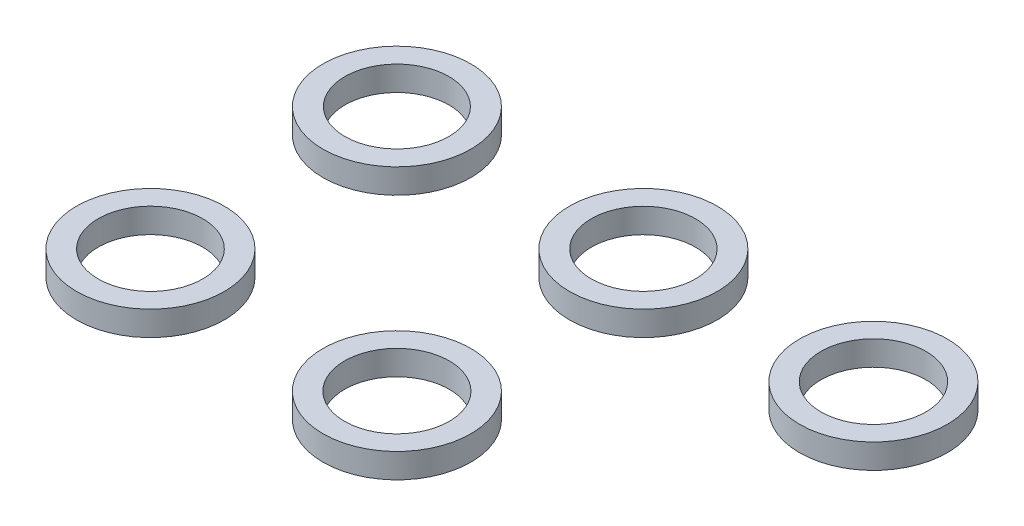
ISO-10303-21;
HEADER;
FILE_DESCRIPTION(('STEP AP214'),'2;1');
FILE_NAME('part.step','',(''),(''),'','','');
FILE_SCHEMA(('AUTOMOTIVE_DESIGN { 1 0 10303 214 1 1 1 1 }'));
ENDSEC;
DATA;
#1=APPLICATION_CONTEXT('core data for automotive mechanical design processes');
#2=APPLICATION_PROTOCOL_DEFINITION('international standard','automotive_design',2000,#1);
#3=PRODUCT_CONTEXT('',#1,'mechanical');
#4=PRODUCT('Part','Part','',(#3));
#5=PRODUCT_RELATED_PRODUCT_CATEGORY('part','',(#4));
#6=PRODUCT_DEFINITION_FORMATION('','',#4);
#7=PRODUCT_DEFINITION_CONTEXT('part definition',#1,'design');
#8=PRODUCT_DEFINITION('design','',#6,#7);
#9=PRODUCT_DEFINITION_SHAPE('','',#8);
#10=(LENGTH_UNIT() NAMED_UNIT(*) SI_UNIT(.MILLI.,.METRE.));
#11=(NAMED_UNIT(*) PLANE_ANGLE_UNIT() SI_UNIT($,.RADIAN.));
#12=(NAMED_UNIT(*) SI_UNIT($,.STERADIAN.) SOLID_ANGLE_UNIT());
#13=UNCERTAINTY_MEASURE_WITH_UNIT(LENGTH_MEASURE(1.E-05),#10,'distance_accuracy_value','');
#14=(GEOMETRIC_REPRESENTATION_CONTEXT(3) GLOBAL_UNCERTAINTY_ASSIGNED_CONTEXT((#13)) GLOBAL_UNIT_ASSIGNED_CONTEXT((#10,
#11,#12)) REPRESENTATION_CONTEXT('',''));
#15=CARTESIAN_POINT('',(0.,0.,0.));
#16=DIRECTION('',(0.,0.,1.));
#17=DIRECTION('',(1.,0.,0.));
#18=AXIS2_PLACEMENT_3D('',#15,#16,#17);
#19=CARTESIAN_POINT('',(96.6723692590399,5.,0.));
#20=DIRECTION('',(0.,1.,0.));
#21=DIRECTION('',(0.,0.,1.));
#22=AXIS2_PLACEMENT_3D('',#19,#20,#21);
#23=PLANE('',#22);
#24=CARTESIAN_POINT('',(96.6723692590399,5.,0.));
#25=DIRECTION('',(0.,1.,0.));
#26=DIRECTION('',(0.,0.,1.));
#27=AXIS2_PLACEMENT_3D('',#24,#25,#26);
#28=CIRCLE('',#27,15.);
#29=CARTESIAN_POINT('',(96.6723692590399,5.,15.));
#30=VERTEX_POINT('',#29);
#31=EDGE_CURVE('E65',#30,#30,#28,.T.);
#32=ORIENTED_EDGE('',*,*,#31,.T.);
#33=EDGE_LOOP('',(#32));
#34=FACE_BOUND('',#33,.T.);
#35=CARTESIAN_POINT('',(96.6723692590399,5.,0.));
#36=DIRECTION('',(0.,1.,0.));
#37=DIRECTION('',(0.,0.,1.));
#38=AXIS2_PLACEMENT_3D('',#35,#36,#37);
#39=CIRCLE('',#38,10.65);
#40=CARTESIAN_POINT('',(96.6723692590399,5.,10.65));
#41=VERTEX_POINT('',#40);
#42=EDGE_CURVE('E56',#41,#41,#39,.T.);
#43=ORIENTED_EDGE('',*,*,#42,.F.);
#44=EDGE_LOOP('',(#43));
#45=FACE_BOUND('',#44,.T.);
#46=ADVANCED_FACE('F52',(#34,#45),#23,.T.);
#47=CARTESIAN_POINT('',(96.6723692590399,0.,0.));
#48=DIRECTION('',(0.,1.,0.));
#49=DIRECTION('',(0.,0.,1.));
#50=AXIS2_PLACEMENT_3D('',#47,#48,#49);
#51=PLANE('',#50);
#52=CARTESIAN_POINT('',(96.6723692590399,0.,0.));
#53=DIRECTION('',(0.,1.,0.));
#54=DIRECTION('',(0.,0.,1.));
#55=AXIS2_PLACEMENT_3D('',#52,#53,#54);
#56=CIRCLE('',#55,15.);
#57=CARTESIAN_POINT('',(96.6723692590399,0.,15.));
#58=VERTEX_POINT('',#57);
#59=EDGE_CURVE('E63',#58,#58,#56,.T.);
#60=ORIENTED_EDGE('',*,*,#59,.F.);
#61=EDGE_LOOP('',(#60));
#62=FACE_BOUND('',#61,.T.);
#63=CARTESIAN_POINT('',(96.6723692590399,0.,0.));
#64=DIRECTION('',(0.,1.,0.));
#65=DIRECTION('',(0.,0.,1.));
#66=AXIS2_PLACEMENT_3D('',#63,#64,#65);
#67=CIRCLE('',#66,10.65);
#68=CARTESIAN_POINT('',(96.6723692590399,0.,10.65));
#69=VERTEX_POINT('',#68);
#70=EDGE_CURVE('E11',#69,#69,#67,.T.);
#71=ORIENTED_EDGE('',*,*,#70,.T.);
#72=EDGE_LOOP('',(#71));
#73=FACE_BOUND('',#72,.T.);
#74=ADVANCED_FACE('F73',(#62,#73),#51,.F.);
#75=CARTESIAN_POINT('',(96.6723692590399,5.,0.));
#76=DIRECTION('',(0.,-1.,0.));
#77=DIRECTION('',(0.,0.,-1.));
#78=AXIS2_PLACEMENT_3D('',#75,#76,#77);
#79=CYLINDRICAL_SURFACE('',#78,15.);
#80=ORIENTED_EDGE('',*,*,#31,.F.);
#81=EDGE_LOOP('',(#80));
#82=FACE_BOUND('',#81,.T.);
#83=ORIENTED_EDGE('',*,*,#59,.T.);
#84=EDGE_LOOP('',(#83));
#85=FACE_BOUND('',#84,.T.);
#86=ADVANCED_FACE('F71',(#82,#85),#79,.T.);
#87=CARTESIAN_POINT('',(96.6723692590399,5.,0.));
#88=DIRECTION('',(0.,-1.,0.));
#89=DIRECTION('',(0.,0.,-1.));
#90=AXIS2_PLACEMENT_3D('',#87,#88,#89);
#91=CYLINDRICAL_SURFACE('',#90,10.65);
#92=ORIENTED_EDGE('',*,*,#42,.T.);
#93=EDGE_LOOP('',(#92));
#94=FACE_BOUND('',#93,.T.);
#95=ORIENTED_EDGE('',*,*,#70,.F.);
#96=EDGE_LOOP('',(#95));
#97=FACE_BOUND('',#96,.T.);
#98=ADVANCED_FACE('F54',(#94,#97),#91,.F.);
#99=CLOSED_SHELL('',(#46,#74,#86,#98));
#100=MANIFOLD_SOLID_BREP('B2',#99);
#101=CARTESIAN_POINT('',(50.,5.,50.));
#102=DIRECTION('',(0.,1.,0.));
#103=DIRECTION('',(0.,0.,1.));
#104=AXIS2_PLACEMENT_3D('',#101,#102,#103);
#105=PLANE('',#104);
#106=CARTESIAN_POINT('',(50.,5.,50.));
#107=DIRECTION('',(0.,1.,0.));
#108=DIRECTION('',(0.,0.,1.));
#109=AXIS2_PLACEMENT_3D('',#106,#107,#108);
#110=CIRCLE('',#109,15.);
#111=CARTESIAN_POINT('',(50.,5.,65.));
#112=VERTEX_POINT('',#111);
#113=EDGE_CURVE('E135',#112,#112,#110,.T.);
#114=ORIENTED_EDGE('',*,*,#113,.T.);
#115=EDGE_LOOP('',(#114));
#116=FACE_BOUND('',#115,.T.);
#117=CARTESIAN_POINT('',(50.,5.,50.));
#118=DIRECTION('',(0.,1.,0.));
#119=DIRECTION('',(0.,0.,1.));
#120=AXIS2_PLACEMENT_3D('',#117,#118,#119);
#121=CIRCLE('',#120,10.625);
#122=CARTESIAN_POINT('',(50.,5.,60.625));
#123=VERTEX_POINT('',#122);
#124=EDGE_CURVE('E126',#123,#123,#121,.T.);
#125=ORIENTED_EDGE('',*,*,#124,.F.);
#126=EDGE_LOOP('',(#125));
#127=FACE_BOUND('',#126,.T.);
#128=ADVANCED_FACE('F122',(#116,#127),#105,.T.);
#129=CARTESIAN_POINT('',(50.,0.,50.));
#130=DIRECTION('',(0.,1.,0.));
#131=DIRECTION('',(0.,0.,1.));
#132=AXIS2_PLACEMENT_3D('',#129,#130,#131);
#133=PLANE('',#132);
#134=CARTESIAN_POINT('',(50.,0.,50.));
#135=DIRECTION('',(0.,1.,0.));
#136=DIRECTION('',(0.,0.,1.));
#137=AXIS2_PLACEMENT_3D('',#134,#135,#136);
#138=CIRCLE('',#137,15.);
#139=CARTESIAN_POINT('',(50.,0.,65.));
#140=VERTEX_POINT('',#139);
#141=EDGE_CURVE('E133',#140,#140,#138,.T.);
#142=ORIENTED_EDGE('',*,*,#141,.F.);
#143=EDGE_LOOP('',(#142));
#144=FACE_BOUND('',#143,.T.);
#145=CARTESIAN_POINT('',(50.,0.,50.));
#146=DIRECTION('',(0.,1.,0.));
#147=DIRECTION('',(0.,0.,1.));
#148=AXIS2_PLACEMENT_3D('',#145,#146,#147);
#149=CIRCLE('',#148,10.625);
#150=CARTESIAN_POINT('',(50.,0.,60.625));
#151=VERTEX_POINT('',#150);
#152=EDGE_CURVE('E51',#151,#151,#149,.T.);
#153=ORIENTED_EDGE('',*,*,#152,.T.);
#154=EDGE_LOOP('',(#153));
#155=FACE_BOUND('',#154,.T.);
#156=ADVANCED_FACE('F143',(#144,#155),#133,.F.);
#157=CARTESIAN_POINT('',(50.,5.,50.));
#158=DIRECTION('',(0.,-1.,0.));
#159=DIRECTION('',(0.,0.,-1.));
#160=AXIS2_PLACEMENT_3D('',#157,#158,#159);
#161=CYLINDRICAL_SURFACE('',#160,15.);
#162=ORIENTED_EDGE('',*,*,#113,.F.);
#163=EDGE_LOOP('',(#162));
#164=FACE_BOUND('',#163,.T.);
#165=ORIENTED_EDGE('',*,*,#141,.T.);
#166=EDGE_LOOP('',(#165));
#167=FACE_BOUND('',#166,.T.);
#168=ADVANCED_FACE('F141',(#164,#167),#161,.T.);
#169=CARTESIAN_POINT('',(50.,5.,50.));
#170=DIRECTION('',(0.,-1.,0.));
#171=DIRECTION('',(0.,0.,-1.));
#172=AXIS2_PLACEMENT_3D('',#169,#170,#171);
#173=CYLINDRICAL_SURFACE('',#172,10.625);
#174=ORIENTED_EDGE('',*,*,#124,.T.);
#175=EDGE_LOOP('',(#174));
#176=FACE_BOUND('',#175,.T.);
#177=ORIENTED_EDGE('',*,*,#152,.F.);
#178=EDGE_LOOP('',(#177));
#179=FACE_BOUND('',#178,.T.);
#180=ADVANCED_FACE('F124',(#176,#179),#173,.F.);
#181=CLOSED_SHELL('',(#128,#156,#168,#180));
#182=MANIFOLD_SOLID_BREP('B6',#181);
#183=CARTESIAN_POINT('',(0.,5.,50.));
#184=DIRECTION('',(0.,1.,0.));
#185=DIRECTION('',(0.,0.,1.));
#186=AXIS2_PLACEMENT_3D('',#183,#184,#185);
#187=PLANE('',#186);
#188=CARTESIAN_POINT('',(0.,5.,50.));
#189=DIRECTION('',(0.,1.,0.));
#190=DIRECTION('',(0.,0.,1.));
#191=AXIS2_PLACEMENT_3D('',#188,#189,#190);
#192=CIRCLE('',#191,15.);
#193=CARTESIAN_POINT('',(0.,5.,65.));
#194=VERTEX_POINT('',#193);
#195=EDGE_CURVE('E205',#194,#194,#192,.T.);
#196=ORIENTED_EDGE('',*,*,#195,.T.);
#197=EDGE_LOOP('',(#196));
#198=FACE_BOUND('',#197,.T.);
#199=CARTESIAN_POINT('',(0.,5.,50.));
#200=DIRECTION('',(0.,1.,0.));
#201=DIRECTION('',(0.,0.,1.));
#202=AXIS2_PLACEMENT_3D('',#199,#200,#201);
#203=CIRCLE('',#202,10.6);
#204=CARTESIAN_POINT('',(0.,5.,60.6));
#205=VERTEX_POINT('',#204);
#206=EDGE_CURVE('E196',#205,#205,#203,.T.);
#207=ORIENTED_EDGE('',*,*,#206,.F.);
#208=EDGE_LOOP('',(#207));
#209=FACE_BOUND('',#208,.T.);
#210=ADVANCED_FACE('F192',(#198,#209),#187,.T.);
#211=CARTESIAN_POINT('',(0.,0.,50.));
#212=DIRECTION('',(0.,1.,0.));
#213=DIRECTION('',(0.,0.,1.));
#214=AXIS2_PLACEMENT_3D('',#211,#212,#213);
#215=PLANE('',#214);
#216=CARTESIAN_POINT('',(0.,0.,50.));
#217=DIRECTION('',(0.,1.,0.));
#218=DIRECTION('',(0.,0.,1.));
#219=AXIS2_PLACEMENT_3D('',#216,#217,#218);
#220=CIRCLE('',#219,15.);
#221=CARTESIAN_POINT('',(0.,0.,65.));
#222=VERTEX_POINT('',#221);
#223=EDGE_CURVE('E203',#222,#222,#220,.T.);
#224=ORIENTED_EDGE('',*,*,#223,.F.);
#225=EDGE_LOOP('',(#224));
#226=FACE_BOUND('',#225,.T.);
#227=CARTESIAN_POINT('',(0.,0.,50.));
#228=DIRECTION('',(0.,1.,0.));
#229=DIRECTION('',(0.,0.,1.));
#230=AXIS2_PLACEMENT_3D('',#227,#228,#229);
#231=CIRCLE('',#230,10.6);
#232=CARTESIAN_POINT('',(0.,0.,60.6));
#233=VERTEX_POINT('',#232);
#234=EDGE_CURVE('E121',#233,#233,#231,.T.);
#235=ORIENTED_EDGE('',*,*,#234,.T.);
#236=EDGE_LOOP('',(#235));
#237=FACE_BOUND('',#236,.T.);
#238=ADVANCED_FACE('F213',(#226,#237),#215,.F.);
#239=CARTESIAN_POINT('',(0.,5.,50.));
#240=DIRECTION('',(0.,-1.,0.));
#241=DIRECTION('',(0.,0.,-1.));
#242=AXIS2_PLACEMENT_3D('',#239,#240,#241);
#243=CYLINDRICAL_SURFACE('',#242,15.);
#244=ORIENTED_EDGE('',*,*,#195,.F.);
#245=EDGE_LOOP('',(#244));
#246=FACE_BOUND('',#245,.T.);
#247=ORIENTED_EDGE('',*,*,#223,.T.);
#248=EDGE_LOOP('',(#247));
#249=FACE_BOUND('',#248,.T.);
#250=ADVANCED_FACE('F211',(#246,#249),#243,.T.);
#251=CARTESIAN_POINT('',(0.,5.,50.));
#252=DIRECTION('',(0.,-1.,0.));
#253=DIRECTION('',(0.,0.,-1.));
#254=AXIS2_PLACEMENT_3D('',#251,#252,#253);
#255=CYLINDRICAL_SURFACE('',#254,10.6);
#256=ORIENTED_EDGE('',*,*,#206,.T.);
#257=EDGE_LOOP('',(#256));
#258=FACE_BOUND('',#257,.T.);
#259=ORIENTED_EDGE('',*,*,#234,.F.);
#260=EDGE_LOOP('',(#259));
#261=FACE_BOUND('',#260,.T.);
#262=ADVANCED_FACE('F194',(#258,#261),#255,.F.);
#263=CLOSED_SHELL('',(#210,#238,#250,#262));
#264=MANIFOLD_SOLID_BREP('B46',#263);
#265=CARTESIAN_POINT('',(50.,5.,0.));
#266=DIRECTION('',(0.,1.,0.));
#267=DIRECTION('',(0.,0.,1.));
#268=AXIS2_PLACEMENT_3D('',#265,#266,#267);
#269=PLANE('',#268);
#270=CARTESIAN_POINT('',(50.,5.,0.));
#271=DIRECTION('',(0.,1.,0.));
#272=DIRECTION('',(0.,0.,1.));
#273=AXIS2_PLACEMENT_3D('',#270,#271,#272);
#274=CIRCLE('',#273,15.);
#275=CARTESIAN_POINT('',(50.,5.,15.));
#276=VERTEX_POINT('',#275);
#277=EDGE_CURVE('E274',#276,#276,#274,.T.);
#278=ORIENTED_EDGE('',*,*,#277,.T.);
#279=EDGE_LOOP('',(#278));
#280=FACE_BOUND('',#279,.T.);
#281=CARTESIAN_POINT('',(50.,5.,0.));
#282=DIRECTION('',(0.,1.,0.));
#283=DIRECTION('',(0.,0.,1.));
#284=AXIS2_PLACEMENT_3D('',#281,#282,#283);
#285=CIRCLE('',#284,10.575);
#286=CARTESIAN_POINT('',(50.,5.,10.575));
#287=VERTEX_POINT('',#286);
#288=EDGE_CURVE('E265',#287,#287,#285,.T.);
#289=ORIENTED_EDGE('',*,*,#288,.F.);
#290=EDGE_LOOP('',(#289));
#291=FACE_BOUND('',#290,.T.);
#292=ADVANCED_FACE('F261',(#280,#291),#269,.T.);
#293=CARTESIAN_POINT('',(50.,0.,0.));
#294=DIRECTION('',(0.,1.,0.));
#295=DIRECTION('',(0.,0.,1.));
#296=AXIS2_PLACEMENT_3D('',#293,#294,#295);
#297=PLANE('',#296);
#298=CARTESIAN_POINT('',(50.,0.,0.));
#299=DIRECTION('',(0.,1.,0.));
#300=DIRECTION('',(0.,0.,1.));
#301=AXIS2_PLACEMENT_3D('',#298,#299,#300);
#302=CIRCLE('',#301,15.);
#303=CARTESIAN_POINT('',(50.,0.,15.));
#304=VERTEX_POINT('',#303);
#305=EDGE_CURVE('E272',#304,#304,#302,.T.);
#306=ORIENTED_EDGE('',*,*,#305,.F.);
#307=EDGE_LOOP('',(#306));
#308=FACE_BOUND('',#307,.T.);
#309=CARTESIAN_POINT('',(50.,0.,0.));
#310=DIRECTION('',(0.,1.,0.));
#311=DIRECTION('',(0.,0.,1.));
#312=AXIS2_PLACEMENT_3D('',#309,#310,#311);
#313=CIRCLE('',#312,10.575);
#314=CARTESIAN_POINT('',(50.,0.,10.575));
#315=VERTEX_POINT('',#314);
#316=EDGE_CURVE('E191',#315,#315,#313,.T.);
#317=ORIENTED_EDGE('',*,*,#316,.T.);
#318=EDGE_LOOP('',(#317));
#319=FACE_BOUND('',#318,.T.);
#320=ADVANCED_FACE('F282',(#308,#319),#297,.F.);
#321=CARTESIAN_POINT('',(50.,5.,0.));
#322=DIRECTION('',(0.,-1.,0.));
#323=DIRECTION('',(0.,0.,-1.));
#324=AXIS2_PLACEMENT_3D('',#321,#322,#323);
#325=CYLINDRICAL_SURFACE('',#324,15.);
#326=ORIENTED_EDGE('',*,*,#277,.F.);
#327=EDGE_LOOP('',(#326));
#328=FACE_BOUND('',#327,.T.);
#329=ORIENTED_EDGE('',*,*,#305,.T.);
#330=EDGE_LOOP('',(#329));
#331=FACE_BOUND('',#330,.T.);
#332=ADVANCED_FACE('F280',(#328,#331),#325,.T.);
#333=CARTESIAN_POINT('',(50.,5.,0.));
#334=DIRECTION('',(0.,-1.,0.));
#335=DIRECTION('',(0.,0.,-1.));
#336=AXIS2_PLACEMENT_3D('',#333,#334,#335);
#337=CYLINDRICAL_SURFACE('',#336,10.575);
#338=ORIENTED_EDGE('',*,*,#288,.T.);
#339=EDGE_LOOP('',(#338));
#340=FACE_BOUND('',#339,.T.);
#341=ORIENTED_EDGE('',*,*,#316,.F.);
#342=EDGE_LOOP('',(#341));
#343=FACE_BOUND('',#342,.T.);
#344=ADVANCED_FACE('F263',(#340,#343),#337,.F.);
#345=CLOSED_SHELL('',(#292,#320,#332,#344));
#346=MANIFOLD_SOLID_BREP('B116',#345);
#347=CARTESIAN_POINT('',(0.,5.,0.));
#348=DIRECTION('',(0.,1.,0.));
#349=DIRECTION('',(0.,0.,1.));
#350=AXIS2_PLACEMENT_3D('',#347,#348,#349);
#351=PLANE('',#350);
#352=CARTESIAN_POINT('',(0.,5.,0.));
#353=DIRECTION('',(0.,1.,0.));
#354=DIRECTION('',(0.,0.,1.));
#355=AXIS2_PLACEMENT_3D('',#352,#353,#354);
#356=CIRCLE('',#355,15.);
#357=CARTESIAN_POINT('',(0.,5.,15.));
#358=VERTEX_POINT('',#357);
#359=EDGE_CURVE('E260',#358,#358,#356,.T.);
#360=ORIENTED_EDGE('',*,*,#359,.T.);
#361=EDGE_LOOP('',(#360));
#362=FACE_BOUND('',#361,.T.);
#363=CARTESIAN_POINT('',(0.,5.,0.));
#364=DIRECTION('',(0.,1.,0.));
#365=DIRECTION('',(0.,0.,1.));
#366=AXIS2_PLACEMENT_3D('',#363,#364,#365);
#367=CIRCLE('',#366,10.55);
#368=CARTESIAN_POINT('',(0.,5.,10.55));
#369=VERTEX_POINT('',#368);
#370=EDGE_CURVE('E336',#369,#369,#367,.T.);
#371=ORIENTED_EDGE('',*,*,#370,.F.);
#372=EDGE_LOOP('',(#371));
#373=FACE_BOUND('',#372,.T.);
#374=ADVANCED_FACE('F323',(#362,#373),#351,.T.);
#375=CARTESIAN_POINT('',(0.,0.,0.));
#376=DIRECTION('',(0.,1.,0.));
#377=DIRECTION('',(0.,0.,1.));
#378=AXIS2_PLACEMENT_3D('',#375,#376,#377);
#379=PLANE('',#378);
#380=CARTESIAN_POINT('',(0.,0.,0.));
#381=DIRECTION('',(0.,1.,0.));
#382=DIRECTION('',(0.,0.,1.));
#383=AXIS2_PLACEMENT_3D('',#380,#381,#382);
#384=CIRCLE('',#383,15.);
#385=CARTESIAN_POINT('',(0.,0.,15.));
#386=VERTEX_POINT('',#385);
#387=EDGE_CURVE('E327',#386,#386,#384,.T.);
#388=ORIENTED_EDGE('',*,*,#387,.F.);
#389=EDGE_LOOP('',(#388));
#390=FACE_BOUND('',#389,.T.);
#391=CARTESIAN_POINT('',(0.,0.,0.));
#392=DIRECTION('',(0.,1.,0.));
#393=DIRECTION('',(0.,0.,1.));
#394=AXIS2_PLACEMENT_3D('',#391,#392,#393);
#395=CIRCLE('',#394,10.55);
#396=CARTESIAN_POINT('',(0.,0.,10.55));
#397=VERTEX_POINT('',#396);
#398=EDGE_CURVE('E338',#397,#397,#395,.T.);
#399=ORIENTED_EDGE('',*,*,#398,.T.);
#400=EDGE_LOOP('',(#399));
#401=FACE_BOUND('',#400,.T.);
#402=ADVANCED_FACE('F350',(#390,#401),#379,.F.);
#403=CARTESIAN_POINT('',(0.,5.,0.));
#404=DIRECTION('',(0.,-1.,0.));
#405=DIRECTION('',(0.,0.,-1.));
#406=AXIS2_PLACEMENT_3D('',#403,#404,#405);
#407=CYLINDRICAL_SURFACE('',#406,15.);
#408=ORIENTED_EDGE('',*,*,#359,.F.);
#409=EDGE_LOOP('',(#408));
#410=FACE_BOUND('',#409,.T.);
#411=ORIENTED_EDGE('',*,*,#387,.T.);
#412=EDGE_LOOP('',(#411));
#413=FACE_BOUND('',#412,.T.);
#414=ADVANCED_FACE('F325',(#410,#413),#407,.T.);
#415=CARTESIAN_POINT('',(0.,5.,0.));
#416=DIRECTION('',(0.,-1.,0.));
#417=DIRECTION('',(0.,0.,-1.));
#418=AXIS2_PLACEMENT_3D('',#415,#416,#417);
#419=CYLINDRICAL_SURFACE('',#418,10.55);
#420=ORIENTED_EDGE('',*,*,#370,.T.);
#421=EDGE_LOOP('',(#420));
#422=FACE_BOUND('',#421,.T.);
#423=ORIENTED_EDGE('',*,*,#398,.F.);
#424=EDGE_LOOP('',(#423));
#425=FACE_BOUND('',#424,.T.);
#426=ADVANCED_FACE('F346',(#422,#425),#419,.F.);
#427=CLOSED_SHELL('',(#374,#402,#414,#426));
#428=MANIFOLD_SOLID_BREP('B186',#427);
#429=ADVANCED_BREP_SHAPE_REPRESENTATION('',(#18,#100,#182,#264,#346,#428),#14);
#430=SHAPE_DEFINITION_REPRESENTATION(#9,#429);
ENDSEC;
END-ISO-10303-21;
